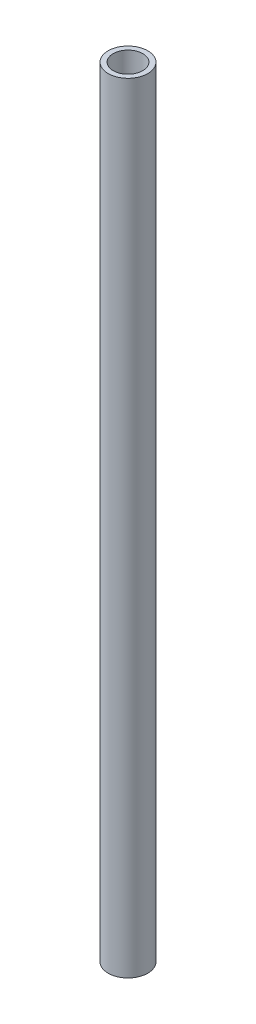
ISO-10303-21;
HEADER;
FILE_DESCRIPTION(('STEP AP214'),'2;1');
FILE_NAME('part.step','',(''),(''),'','','');
FILE_SCHEMA(('AUTOMOTIVE_DESIGN { 1 0 10303 214 1 1 1 1 }'));
ENDSEC;
DATA;
#1=APPLICATION_CONTEXT('core data for automotive mechanical design processes');
#2=APPLICATION_PROTOCOL_DEFINITION('international standard','automotive_design',2000,#1);
#3=PRODUCT_CONTEXT('',#1,'mechanical');
#4=PRODUCT('Part','Part','',(#3));
#5=PRODUCT_RELATED_PRODUCT_CATEGORY('part','',(#4));
#6=PRODUCT_DEFINITION_FORMATION('','',#4);
#7=PRODUCT_DEFINITION_CONTEXT('part definition',#1,'design');
#8=PRODUCT_DEFINITION('design','',#6,#7);
#9=PRODUCT_DEFINITION_SHAPE('','',#8);
#10=(LENGTH_UNIT() NAMED_UNIT(*) SI_UNIT(.MILLI.,.METRE.));
#11=(NAMED_UNIT(*) PLANE_ANGLE_UNIT() SI_UNIT($,.RADIAN.));
#12=(NAMED_UNIT(*) SI_UNIT($,.STERADIAN.) SOLID_ANGLE_UNIT());
#13=UNCERTAINTY_MEASURE_WITH_UNIT(LENGTH_MEASURE(1.E-05),#10,'distance_accuracy_value','');
#14=(GEOMETRIC_REPRESENTATION_CONTEXT(3) GLOBAL_UNCERTAINTY_ASSIGNED_CONTEXT((#13)) GLOBAL_UNIT_ASSIGNED_CONTEXT((#10,
#11,#12)) REPRESENTATION_CONTEXT('',''));
#15=CARTESIAN_POINT('',(0.,0.,0.));
#16=DIRECTION('',(0.,0.,1.));
#17=DIRECTION('',(1.,0.,0.));
#18=AXIS2_PLACEMENT_3D('',#15,#16,#17);
#19=CARTESIAN_POINT('',(0.,500.,0.));
#20=DIRECTION('',(0.,1.,0.));
#21=DIRECTION('',(0.,0.,1.));
#22=AXIS2_PLACEMENT_3D('',#19,#20,#21);
#23=PLANE('',#22);
#24=CARTESIAN_POINT('',(0.,500.,0.));
#25=DIRECTION('',(0.,1.,0.));
#26=DIRECTION('',(0.,0.,1.));
#27=AXIS2_PLACEMENT_3D('',#24,#25,#26);
#28=CIRCLE('',#27,12.7);
#29=CARTESIAN_POINT('',(0.,500.,12.7));
#30=VERTEX_POINT('',#29);
#31=EDGE_CURVE('E10',#30,#30,#28,.T.);
#32=ORIENTED_EDGE('',*,*,#31,.T.);
#33=EDGE_LOOP('',(#32));
#34=FACE_BOUND('',#33,.T.);
#35=CARTESIAN_POINT('',(0.,500.,0.));
#36=DIRECTION('',(0.,1.,0.));
#37=DIRECTION('',(0.,0.,1.));
#38=AXIS2_PLACEMENT_3D('',#35,#36,#37);
#39=CIRCLE('',#38,9.5);
#40=CARTESIAN_POINT('',(0.,500.,9.5));
#41=VERTEX_POINT('',#40);
#42=EDGE_CURVE('E43',#41,#41,#39,.T.);
#43=ORIENTED_EDGE('',*,*,#42,.F.);
#44=EDGE_LOOP('',(#43));
#45=FACE_BOUND('',#44,.T.);
#46=ADVANCED_FACE('F32',(#34,#45),#23,.T.);
#47=CARTESIAN_POINT('',(0.,0.,0.));
#48=DIRECTION('',(0.,1.,0.));
#49=DIRECTION('',(0.,0.,1.));
#50=AXIS2_PLACEMENT_3D('',#47,#48,#49);
#51=PLANE('',#50);
#52=CARTESIAN_POINT('',(0.,0.,0.));
#53=DIRECTION('',(0.,1.,0.));
#54=DIRECTION('',(0.,0.,1.));
#55=AXIS2_PLACEMENT_3D('',#52,#53,#54);
#56=CIRCLE('',#55,12.7);
#57=CARTESIAN_POINT('',(0.,0.,12.7));
#58=VERTEX_POINT('',#57);
#59=EDGE_CURVE('E36',#58,#58,#56,.T.);
#60=ORIENTED_EDGE('',*,*,#59,.F.);
#61=EDGE_LOOP('',(#60));
#62=FACE_BOUND('',#61,.T.);
#63=CARTESIAN_POINT('',(0.,0.,0.));
#64=DIRECTION('',(0.,1.,0.));
#65=DIRECTION('',(0.,0.,1.));
#66=AXIS2_PLACEMENT_3D('',#63,#64,#65);
#67=CIRCLE('',#66,9.5);
#68=CARTESIAN_POINT('',(0.,0.,9.5));
#69=VERTEX_POINT('',#68);
#70=EDGE_CURVE('E45',#69,#69,#67,.T.);
#71=ORIENTED_EDGE('',*,*,#70,.T.);
#72=EDGE_LOOP('',(#71));
#73=FACE_BOUND('',#72,.T.);
#74=ADVANCED_FACE('F55',(#62,#73),#51,.F.);
#75=CARTESIAN_POINT('',(0.,500.,0.));
#76=DIRECTION('',(0.,-1.,0.));
#77=DIRECTION('',(0.,0.,-1.));
#78=AXIS2_PLACEMENT_3D('',#75,#76,#77);
#79=CYLINDRICAL_SURFACE('',#78,12.7);
#80=ORIENTED_EDGE('',*,*,#31,.F.);
#81=EDGE_LOOP('',(#80));
#82=FACE_BOUND('',#81,.T.);
#83=ORIENTED_EDGE('',*,*,#59,.T.);
#84=EDGE_LOOP('',(#83));
#85=FACE_BOUND('',#84,.T.);
#86=ADVANCED_FACE('F34',(#82,#85),#79,.T.);
#87=CARTESIAN_POINT('',(0.,500.,0.));
#88=DIRECTION('',(0.,-1.,0.));
#89=DIRECTION('',(0.,0.,-1.));
#90=AXIS2_PLACEMENT_3D('',#87,#88,#89);
#91=CYLINDRICAL_SURFACE('',#90,9.5);
#92=ORIENTED_EDGE('',*,*,#42,.T.);
#93=EDGE_LOOP('',(#92));
#94=FACE_BOUND('',#93,.T.);
#95=ORIENTED_EDGE('',*,*,#70,.F.);
#96=EDGE_LOOP('',(#95));
#97=FACE_BOUND('',#96,.T.);
#98=ADVANCED_FACE('F51',(#94,#97),#91,.F.);
#99=CLOSED_SHELL('',(#46,#74,#86,#98));
#100=MANIFOLD_SOLID_BREP('B2',#99);
#101=ADVANCED_BREP_SHAPE_REPRESENTATION('',(#18,#100),#14);
#102=SHAPE_DEFINITION_REPRESENTATION(#9,#101);
ENDSEC;
END-ISO-10303-21;
